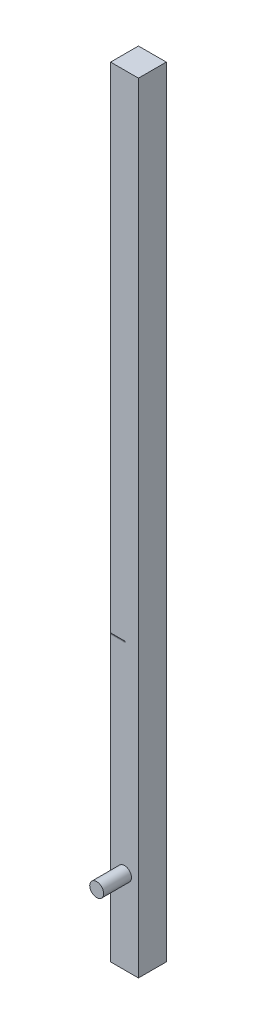
ISO-10303-21;
HEADER;
FILE_DESCRIPTION(('STEP AP214'),'2;1');
FILE_NAME('part.step','',(''),(''),'','','');
FILE_SCHEMA(('AUTOMOTIVE_DESIGN { 1 0 10303 214 1 1 1 1 }'));
ENDSEC;
DATA;
#1=APPLICATION_CONTEXT('core data for automotive mechanical design processes');
#2=APPLICATION_PROTOCOL_DEFINITION('international standard','automotive_design',2000,#1);
#3=PRODUCT_CONTEXT('',#1,'mechanical');
#4=PRODUCT('Part','Part','',(#3));
#5=PRODUCT_RELATED_PRODUCT_CATEGORY('part','',(#4));
#6=PRODUCT_DEFINITION_FORMATION('','',#4);
#7=PRODUCT_DEFINITION_CONTEXT('part definition',#1,'design');
#8=PRODUCT_DEFINITION('design','',#6,#7);
#9=PRODUCT_DEFINITION_SHAPE('','',#8);
#10=(LENGTH_UNIT() NAMED_UNIT(*) SI_UNIT(.MILLI.,.METRE.));
#11=(NAMED_UNIT(*) PLANE_ANGLE_UNIT() SI_UNIT($,.RADIAN.));
#12=(NAMED_UNIT(*) SI_UNIT($,.STERADIAN.) SOLID_ANGLE_UNIT());
#13=UNCERTAINTY_MEASURE_WITH_UNIT(LENGTH_MEASURE(1.E-05),#10,'distance_accuracy_value','');
#14=(GEOMETRIC_REPRESENTATION_CONTEXT(3) GLOBAL_UNCERTAINTY_ASSIGNED_CONTEXT((#13)) GLOBAL_UNIT_ASSIGNED_CONTEXT((#10,
#11,#12)) REPRESENTATION_CONTEXT('',''));
#15=CARTESIAN_POINT('',(0.,0.,0.));
#16=DIRECTION('',(0.,0.,1.));
#17=DIRECTION('',(1.,0.,0.));
#18=AXIS2_PLACEMENT_3D('',#15,#16,#17);
#19=CARTESIAN_POINT('',(-5.,280.,5.));
#20=DIRECTION('',(0.,0.,-1.));
#21=DIRECTION('',(-1.,0.,0.));
#22=AXIS2_PLACEMENT_3D('',#19,#20,#21);
#23=PLANE('',#22);
#24=DIRECTION('',(1.,0.,0.));
#25=VECTOR('',#24,1.);
#26=CARTESIAN_POINT('',(-5.,0.,5.));
#27=LINE('',#26,#25);
#28=CARTESIAN_POINT('',(-5.,0.,5.));
#29=VERTEX_POINT('',#28);
#30=CARTESIAN_POINT('',(5.,0.,5.));
#31=VERTEX_POINT('',#30);
#32=EDGE_CURVE('E147',#29,#31,#27,.T.);
#33=ORIENTED_EDGE('',*,*,#32,.T.);
#34=DIRECTION('',(0.,-1.,0.));
#35=VECTOR('',#34,1.);
#36=CARTESIAN_POINT('',(5.,280.,5.));
#37=LINE('',#36,#35);
#38=CARTESIAN_POINT('',(5.,280.,5.));
#39=VERTEX_POINT('',#38);
#40=EDGE_CURVE('E156',#39,#31,#37,.T.);
#41=ORIENTED_EDGE('',*,*,#40,.F.);
#42=DIRECTION('',(1.,0.,0.));
#43=VECTOR('',#42,1.);
#44=CARTESIAN_POINT('',(-5.,280.,5.));
#45=LINE('',#44,#43);
#46=CARTESIAN_POINT('',(-5.,280.,5.));
#47=VERTEX_POINT('',#46);
#48=EDGE_CURVE('E153',#47,#39,#45,.T.);
#49=ORIENTED_EDGE('',*,*,#48,.F.);
#50=DIRECTION('',(0.,-1.,0.));
#51=VECTOR('',#50,1.);
#52=CARTESIAN_POINT('',(-5.,280.,5.));
#53=LINE('',#52,#51);
#54=EDGE_CURVE('E171',#47,#29,#53,.T.);
#55=ORIENTED_EDGE('',*,*,#54,.T.);
#56=EDGE_LOOP('',(#33,#41,#49,#55));
#57=FACE_BOUND('',#56,.T.);
#58=CARTESIAN_POINT('',(0.,30.,5.));
#59=DIRECTION('',(0.,0.,-1.));
#60=DIRECTION('',(-1.,0.,0.));
#61=AXIS2_PLACEMENT_3D('',#58,#59,#60);
#62=CIRCLE('',#61,2.5);
#63=CARTESIAN_POINT('',(-2.5,30.,5.));
#64=VERTEX_POINT('',#63);
#65=EDGE_CURVE('E11',#64,#64,#62,.F.);
#66=ORIENTED_EDGE('',*,*,#65,.F.);
#67=EDGE_LOOP('',(#66));
#68=FACE_BOUND('',#67,.T.);
#69=DIRECTION('',(0.,1.,0.));
#70=VECTOR('',#69,1.);
#71=CARTESIAN_POINT('',(0.439242854946245,102.398947231519,5.));
#72=LINE('',#71,#70);
#73=CARTESIAN_POINT('',(0.439242854946245,102.085649182071,5.));
#74=VERTEX_POINT('',#73);
#75=CARTESIAN_POINT('',(0.439242854946245,102.398947231519,5.));
#76=VERTEX_POINT('',#75);
#77=EDGE_CURVE('E129',#74,#76,#72,.T.);
#78=ORIENTED_EDGE('',*,*,#77,.F.);
#79=DIRECTION('',(1.,0.,0.));
#80=VECTOR('',#79,1.);
#81=CARTESIAN_POINT('',(-4.88682398566621,102.085649182071,5.));
#82=LINE('',#81,#80);
#83=CARTESIAN_POINT('',(-4.88682398566621,102.085649182071,5.));
#84=VERTEX_POINT('',#83);
#85=EDGE_CURVE('E126',#84,#74,#82,.T.);
#86=ORIENTED_EDGE('',*,*,#85,.F.);
#87=DIRECTION('',(0.,-1.,0.));
#88=VECTOR('',#87,1.);
#89=CARTESIAN_POINT('',(-4.88682398566621,102.398947231519,5.));
#90=LINE('',#89,#88);
#91=CARTESIAN_POINT('',(-4.88682398566621,102.398947231519,5.));
#92=VERTEX_POINT('',#91);
#93=EDGE_CURVE('E62',#92,#84,#90,.T.);
#94=ORIENTED_EDGE('',*,*,#93,.F.);
#95=DIRECTION('',(-1.,0.,0.));
#96=VECTOR('',#95,1.);
#97=CARTESIAN_POINT('',(-4.88682398566621,102.398947231519,5.));
#98=LINE('',#97,#96);
#99=EDGE_CURVE('E57',#76,#92,#98,.T.);
#100=ORIENTED_EDGE('',*,*,#99,.F.);
#101=EDGE_LOOP('',(#78,#86,#94,#100));
#102=FACE_BOUND('',#101,.T.);
#103=ADVANCED_FACE('F41',(#57,#68,#102),#23,.F.);
#104=CARTESIAN_POINT('',(5.,280.,-5.));
#105=DIRECTION('',(-1.,0.,0.));
#106=DIRECTION('',(0.,0.,1.));
#107=AXIS2_PLACEMENT_3D('',#104,#105,#106);
#108=PLANE('',#107);
#109=DIRECTION('',(0.,0.,-1.));
#110=VECTOR('',#109,1.);
#111=CARTESIAN_POINT('',(5.,0.,-5.));
#112=LINE('',#111,#110);
#113=CARTESIAN_POINT('',(5.,0.,-5.));
#114=VERTEX_POINT('',#113);
#115=EDGE_CURVE('E136',#31,#114,#112,.T.);
#116=ORIENTED_EDGE('',*,*,#115,.T.);
#117=DIRECTION('',(0.,-1.,0.));
#118=VECTOR('',#117,1.);
#119=CARTESIAN_POINT('',(5.,280.,-5.));
#120=LINE('',#119,#118);
#121=CARTESIAN_POINT('',(5.,280.,-5.));
#122=VERTEX_POINT('',#121);
#123=EDGE_CURVE('E50',#122,#114,#120,.T.);
#124=ORIENTED_EDGE('',*,*,#123,.F.);
#125=DIRECTION('',(0.,0.,-1.));
#126=VECTOR('',#125,1.);
#127=CARTESIAN_POINT('',(5.,280.,-5.));
#128=LINE('',#127,#126);
#129=EDGE_CURVE('E142',#39,#122,#128,.T.);
#130=ORIENTED_EDGE('',*,*,#129,.F.);
#131=ORIENTED_EDGE('',*,*,#40,.T.);
#132=EDGE_LOOP('',(#116,#124,#130,#131));
#133=FACE_BOUND('',#132,.T.);
#134=ADVANCED_FACE('F43',(#133),#108,.F.);
#135=CARTESIAN_POINT('',(-5.,280.,-5.));
#136=DIRECTION('',(0.,0.,1.));
#137=DIRECTION('',(1.,0.,0.));
#138=AXIS2_PLACEMENT_3D('',#135,#136,#137);
#139=PLANE('',#138);
#140=DIRECTION('',(-1.,0.,0.));
#141=VECTOR('',#140,1.);
#142=CARTESIAN_POINT('',(-5.,0.,-5.));
#143=LINE('',#142,#141);
#144=CARTESIAN_POINT('',(-5.,0.,-5.));
#145=VERTEX_POINT('',#144);
#146=EDGE_CURVE('E160',#114,#145,#143,.T.);
#147=ORIENTED_EDGE('',*,*,#146,.T.);
#148=DIRECTION('',(0.,-1.,0.));
#149=VECTOR('',#148,1.);
#150=CARTESIAN_POINT('',(-5.,280.,-5.));
#151=LINE('',#150,#149);
#152=CARTESIAN_POINT('',(-5.,280.,-5.));
#153=VERTEX_POINT('',#152);
#154=EDGE_CURVE('E175',#153,#145,#151,.T.);
#155=ORIENTED_EDGE('',*,*,#154,.F.);
#156=DIRECTION('',(-1.,0.,0.));
#157=VECTOR('',#156,1.);
#158=CARTESIAN_POINT('',(-5.,280.,-5.));
#159=LINE('',#158,#157);
#160=EDGE_CURVE('E146',#122,#153,#159,.T.);
#161=ORIENTED_EDGE('',*,*,#160,.F.);
#162=ORIENTED_EDGE('',*,*,#123,.T.);
#163=EDGE_LOOP('',(#147,#155,#161,#162));
#164=FACE_BOUND('',#163,.T.);
#165=ADVANCED_FACE('F182',(#164),#139,.F.);
#166=CARTESIAN_POINT('',(-5.,280.,-5.));
#167=DIRECTION('',(1.,0.,0.));
#168=DIRECTION('',(0.,0.,-1.));
#169=AXIS2_PLACEMENT_3D('',#166,#167,#168);
#170=PLANE('',#169);
#171=DIRECTION('',(0.,0.,1.));
#172=VECTOR('',#171,1.);
#173=CARTESIAN_POINT('',(-5.,0.,-5.));
#174=LINE('',#173,#172);
#175=EDGE_CURVE('E163',#145,#29,#174,.T.);
#176=ORIENTED_EDGE('',*,*,#175,.T.);
#177=ORIENTED_EDGE('',*,*,#54,.F.);
#178=DIRECTION('',(0.,0.,1.));
#179=VECTOR('',#178,1.);
#180=CARTESIAN_POINT('',(-5.,280.,-5.));
#181=LINE('',#180,#179);
#182=EDGE_CURVE('E150',#153,#47,#181,.T.);
#183=ORIENTED_EDGE('',*,*,#182,.F.);
#184=ORIENTED_EDGE('',*,*,#154,.T.);
#185=EDGE_LOOP('',(#176,#177,#183,#184));
#186=FACE_BOUND('',#185,.T.);
#187=ADVANCED_FACE('F194',(#186),#170,.F.);
#188=CARTESIAN_POINT('',(0.,280.,0.));
#189=DIRECTION('',(0.,1.,0.));
#190=DIRECTION('',(0.,0.,1.));
#191=AXIS2_PLACEMENT_3D('',#188,#189,#190);
#192=PLANE('',#191);
#193=ORIENTED_EDGE('',*,*,#129,.T.);
#194=ORIENTED_EDGE('',*,*,#160,.T.);
#195=ORIENTED_EDGE('',*,*,#182,.T.);
#196=ORIENTED_EDGE('',*,*,#48,.T.);
#197=EDGE_LOOP('',(#193,#194,#195,#196));
#198=FACE_BOUND('',#197,.T.);
#199=ADVANCED_FACE('F200',(#198),#192,.T.);
#200=CARTESIAN_POINT('',(0.,0.,0.));
#201=DIRECTION('',(0.,1.,0.));
#202=DIRECTION('',(0.,0.,1.));
#203=AXIS2_PLACEMENT_3D('',#200,#201,#202);
#204=PLANE('',#203);
#205=ORIENTED_EDGE('',*,*,#115,.F.);
#206=ORIENTED_EDGE('',*,*,#32,.F.);
#207=ORIENTED_EDGE('',*,*,#175,.F.);
#208=ORIENTED_EDGE('',*,*,#146,.F.);
#209=EDGE_LOOP('',(#205,#206,#207,#208));
#210=FACE_BOUND('',#209,.T.);
#211=ADVANCED_FACE('F190',(#210),#204,.F.);
#212=CARTESIAN_POINT('',(0.,30.,15.));
#213=DIRECTION('',(0.,0.,-1.));
#214=DIRECTION('',(-1.,0.,0.));
#215=AXIS2_PLACEMENT_3D('',#212,#213,#214);
#216=CYLINDRICAL_SURFACE('',#215,2.5);
#217=CARTESIAN_POINT('',(0.,30.,15.));
#218=DIRECTION('',(0.,0.,1.));
#219=DIRECTION('',(1.,0.,0.));
#220=AXIS2_PLACEMENT_3D('',#217,#218,#219);
#221=CIRCLE('',#220,2.5);
#222=CARTESIAN_POINT('',(2.5,30.,15.));
#223=VERTEX_POINT('',#222);
#224=EDGE_CURVE('E131',#223,#223,#221,.T.);
#225=ORIENTED_EDGE('',*,*,#224,.F.);
#226=EDGE_LOOP('',(#225));
#227=FACE_BOUND('',#226,.T.);
#228=ORIENTED_EDGE('',*,*,#65,.T.);
#229=EDGE_LOOP('',(#228));
#230=FACE_BOUND('',#229,.T.);
#231=ADVANCED_FACE('F207',(#227,#230),#216,.T.);
#232=CARTESIAN_POINT('',(0.,0.,15.));
#233=DIRECTION('',(0.,0.,1.));
#234=DIRECTION('',(1.,0.,0.));
#235=AXIS2_PLACEMENT_3D('',#232,#233,#234);
#236=PLANE('',#235);
#237=ORIENTED_EDGE('',*,*,#224,.T.);
#238=EDGE_LOOP('',(#237));
#239=FACE_BOUND('',#238,.T.);
#240=ADVANCED_FACE('F245',(#239),#236,.T.);
#241=CARTESIAN_POINT('',(0.439242854946245,102.398947231519,5.1));
#242=DIRECTION('',(-1.,0.,0.));
#243=DIRECTION('',(0.,0.,1.));
#244=AXIS2_PLACEMENT_3D('',#241,#242,#243);
#245=PLANE('',#244);
#246=ORIENTED_EDGE('',*,*,#77,.T.);
#247=DIRECTION('',(0.,0.,-1.));
#248=VECTOR('',#247,1.);
#249=CARTESIAN_POINT('',(0.439242854946245,102.398947231519,5.1));
#250=LINE('',#249,#248);
#251=CARTESIAN_POINT('',(0.439242854946245,102.398947231519,5.1));
#252=VERTEX_POINT('',#251);
#253=EDGE_CURVE('E108',#252,#76,#250,.T.);
#254=ORIENTED_EDGE('',*,*,#253,.F.);
#255=DIRECTION('',(0.,1.,0.));
#256=VECTOR('',#255,1.);
#257=CARTESIAN_POINT('',(0.439242854946245,102.398947231519,5.1));
#258=LINE('',#257,#256);
#259=CARTESIAN_POINT('',(0.439242854946245,102.085649182071,5.1));
#260=VERTEX_POINT('',#259);
#261=EDGE_CURVE('E116',#260,#252,#258,.T.);
#262=ORIENTED_EDGE('',*,*,#261,.F.);
#263=DIRECTION('',(0.,0.,-1.));
#264=VECTOR('',#263,1.);
#265=CARTESIAN_POINT('',(0.439242854946245,102.085649182071,5.1));
#266=LINE('',#265,#264);
#267=EDGE_CURVE('E307',#260,#74,#266,.T.);
#268=ORIENTED_EDGE('',*,*,#267,.T.);
#269=EDGE_LOOP('',(#246,#254,#262,#268));
#270=FACE_BOUND('',#269,.T.);
#271=ADVANCED_FACE('F128',(#270),#245,.F.);
#272=CARTESIAN_POINT('',(-4.88682398566621,102.398947231519,5.1));
#273=DIRECTION('',(0.,-1.,0.));
#274=DIRECTION('',(0.,0.,-1.));
#275=AXIS2_PLACEMENT_3D('',#272,#273,#274);
#276=PLANE('',#275);
#277=ORIENTED_EDGE('',*,*,#99,.T.);
#278=DIRECTION('',(0.,0.,-1.));
#279=VECTOR('',#278,1.);
#280=CARTESIAN_POINT('',(-4.88682398566621,102.398947231519,5.1));
#281=LINE('',#280,#279);
#282=CARTESIAN_POINT('',(-4.88682398566621,102.398947231519,5.1));
#283=VERTEX_POINT('',#282);
#284=EDGE_CURVE('E111',#283,#92,#281,.T.);
#285=ORIENTED_EDGE('',*,*,#284,.F.);
#286=DIRECTION('',(-1.,0.,0.));
#287=VECTOR('',#286,1.);
#288=CARTESIAN_POINT('',(-4.88682398566621,102.398947231519,5.1));
#289=LINE('',#288,#287);
#290=EDGE_CURVE('E104',#252,#283,#289,.T.);
#291=ORIENTED_EDGE('',*,*,#290,.F.);
#292=ORIENTED_EDGE('',*,*,#253,.T.);
#293=EDGE_LOOP('',(#277,#285,#291,#292));
#294=FACE_BOUND('',#293,.T.);
#295=ADVANCED_FACE('F106',(#294),#276,.F.);
#296=CARTESIAN_POINT('',(-4.88682398566621,102.398947231519,5.1));
#297=DIRECTION('',(1.,0.,0.));
#298=DIRECTION('',(0.,0.,-1.));
#299=AXIS2_PLACEMENT_3D('',#296,#297,#298);
#300=PLANE('',#299);
#301=ORIENTED_EDGE('',*,*,#93,.T.);
#302=DIRECTION('',(0.,0.,-1.));
#303=VECTOR('',#302,1.);
#304=CARTESIAN_POINT('',(-4.88682398566621,102.085649182071,5.1));
#305=LINE('',#304,#303);
#306=CARTESIAN_POINT('',(-4.88682398566621,102.085649182071,5.1));
#307=VERTEX_POINT('',#306);
#308=EDGE_CURVE('E138',#307,#84,#305,.T.);
#309=ORIENTED_EDGE('',*,*,#308,.F.);
#310=DIRECTION('',(0.,-1.,0.));
#311=VECTOR('',#310,1.);
#312=CARTESIAN_POINT('',(-4.88682398566621,102.398947231519,5.1));
#313=LINE('',#312,#311);
#314=EDGE_CURVE('E115',#283,#307,#313,.T.);
#315=ORIENTED_EDGE('',*,*,#314,.F.);
#316=ORIENTED_EDGE('',*,*,#284,.T.);
#317=EDGE_LOOP('',(#301,#309,#315,#316));
#318=FACE_BOUND('',#317,.T.);
#319=ADVANCED_FACE('F271',(#318),#300,.F.);
#320=CARTESIAN_POINT('',(-4.88682398566621,102.085649182071,5.1));
#321=DIRECTION('',(0.,1.,0.));
#322=DIRECTION('',(0.,0.,1.));
#323=AXIS2_PLACEMENT_3D('',#320,#321,#322);
#324=PLANE('',#323);
#325=ORIENTED_EDGE('',*,*,#85,.T.);
#326=ORIENTED_EDGE('',*,*,#267,.F.);
#327=DIRECTION('',(1.,0.,0.));
#328=VECTOR('',#327,1.);
#329=CARTESIAN_POINT('',(-4.88682398566621,102.085649182071,5.1));
#330=LINE('',#329,#328);
#331=EDGE_CURVE('E121',#307,#260,#330,.T.);
#332=ORIENTED_EDGE('',*,*,#331,.F.);
#333=ORIENTED_EDGE('',*,*,#308,.T.);
#334=EDGE_LOOP('',(#325,#326,#332,#333));
#335=FACE_BOUND('',#334,.T.);
#336=ADVANCED_FACE('F278',(#335),#324,.F.);
#337=CARTESIAN_POINT('',(0.,0.,5.1));
#338=DIRECTION('',(0.,0.,1.));
#339=DIRECTION('',(1.,0.,0.));
#340=AXIS2_PLACEMENT_3D('',#337,#338,#339);
#341=PLANE('',#340);
#342=ORIENTED_EDGE('',*,*,#261,.T.);
#343=ORIENTED_EDGE('',*,*,#290,.T.);
#344=ORIENTED_EDGE('',*,*,#314,.T.);
#345=ORIENTED_EDGE('',*,*,#331,.T.);
#346=EDGE_LOOP('',(#342,#343,#344,#345));
#347=FACE_BOUND('',#346,.T.);
#348=ADVANCED_FACE('F119',(#347),#341,.T.);
#349=CLOSED_SHELL('',(#103,#134,#165,#187,#199,#211,#231,#240,#271,#295,#319,#336,#348));
#350=MANIFOLD_SOLID_BREP('B2',#349);
#351=ADVANCED_BREP_SHAPE_REPRESENTATION('',(#18,#350),#14);
#352=SHAPE_DEFINITION_REPRESENTATION(#9,#351);
ENDSEC;
END-ISO-10303-21;
